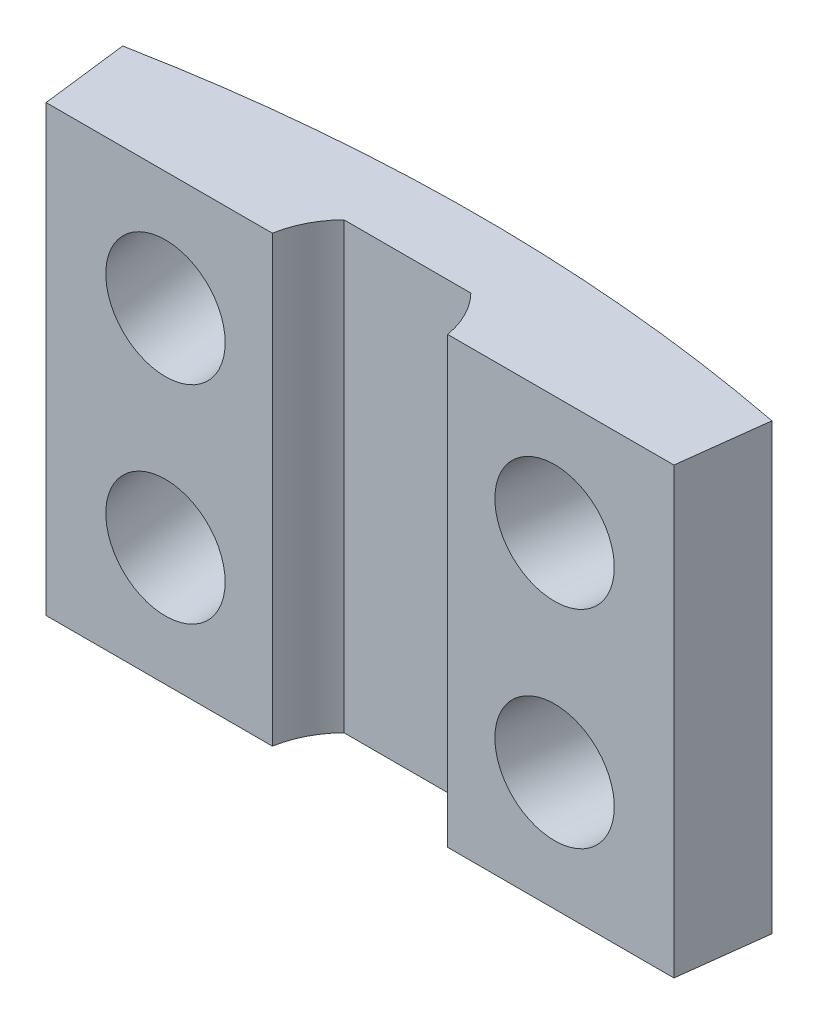
ISO-10303-21;
HEADER;
FILE_DESCRIPTION(('STEP AP214'),'2;1');
FILE_NAME('part.step','',(''),(''),'','','');
FILE_SCHEMA(('AUTOMOTIVE_DESIGN { 1 0 10303 214 1 1 1 1 }'));
ENDSEC;
DATA;
#1=APPLICATION_CONTEXT('core data for automotive mechanical design processes');
#2=APPLICATION_PROTOCOL_DEFINITION('international standard','automotive_design',2000,#1);
#3=PRODUCT_CONTEXT('',#1,'mechanical');
#4=PRODUCT('Part','Part','',(#3));
#5=PRODUCT_RELATED_PRODUCT_CATEGORY('part','',(#4));
#6=PRODUCT_DEFINITION_FORMATION('','',#4);
#7=PRODUCT_DEFINITION_CONTEXT('part definition',#1,'design');
#8=PRODUCT_DEFINITION('design','',#6,#7);
#9=PRODUCT_DEFINITION_SHAPE('','',#8);
#10=(LENGTH_UNIT() NAMED_UNIT(*) SI_UNIT(.MILLI.,.METRE.));
#11=(NAMED_UNIT(*) PLANE_ANGLE_UNIT() SI_UNIT($,.RADIAN.));
#12=(NAMED_UNIT(*) SI_UNIT($,.STERADIAN.) SOLID_ANGLE_UNIT());
#13=UNCERTAINTY_MEASURE_WITH_UNIT(LENGTH_MEASURE(1.E-05),#10,'distance_accuracy_value','');
#14=(GEOMETRIC_REPRESENTATION_CONTEXT(3) GLOBAL_UNCERTAINTY_ASSIGNED_CONTEXT((#13)) GLOBAL_UNIT_ASSIGNED_CONTEXT((#10,
#11,#12)) REPRESENTATION_CONTEXT('',''));
#15=CARTESIAN_POINT('',(0.,0.,0.));
#16=DIRECTION('',(0.,0.,1.));
#17=DIRECTION('',(1.,0.,0.));
#18=AXIS2_PLACEMENT_3D('',#15,#16,#17);
#19=CARTESIAN_POINT('',(0.,15.,0.));
#20=DIRECTION('',(0.,-1.,0.));
#21=DIRECTION('',(0.,0.,-1.));
#22=AXIS2_PLACEMENT_3D('',#19,#20,#21);
#23=CYLINDRICAL_SURFACE('',#22,57.5);
#24=CARTESIAN_POINT('',(8.98833933252168,4.,-56.7931312399963));
#25=CARTESIAN_POINT('',(8.98833445767635,4.11230441527091,-56.7931323111404));
#26=CARTESIAN_POINT('',(8.97895966302704,4.22468939699142,-56.7946181695748));
#27=CARTESIAN_POINT('',(8.94168989126605,4.44636171808973,-56.8004975689089));
#28=CARTESIAN_POINT('',(8.91377284993285,4.55564520512402,-56.8048945738879));
#29=CARTESIAN_POINT('',(8.84020655296178,4.76787114271785,-56.8163895913999));
#30=CARTESIAN_POINT('',(8.79456604268353,4.87081669165127,-56.8234862717865));
#31=CARTESIAN_POINT('',(8.6868458773733,5.06746830297798,-56.8400533409228));
#32=CARTESIAN_POINT('',(8.6247702096139,5.16117659883002,-56.8495231539058));
#33=CARTESIAN_POINT('',(8.4858826551236,5.33677516165288,-56.8704203851645));
#34=CARTESIAN_POINT('',(8.40906367088088,5.41865970319886,-56.8818487460108));
#35=CARTESIAN_POINT('',(8.24286268284989,5.56823796796951,-56.9061706089331));
#36=CARTESIAN_POINT('',(8.15348017660247,5.63593112336117,-56.9190641696037));
#37=CARTESIAN_POINT('',(7.96464578014412,5.75521635514299,-56.9457943936794));
#38=CARTESIAN_POINT('',(7.86519152913229,5.8068046449554,-56.9596312779485));
#39=CARTESIAN_POINT('',(7.65903682424394,5.89239123560131,-56.9877176777634));
#40=CARTESIAN_POINT('',(7.55233640440703,5.92638961905869,-57.0019671913706));
#41=CARTESIAN_POINT('',(7.3347525885909,5.97581803145167,-57.0303728763571));
#42=CARTESIAN_POINT('',(7.22387091716941,5.9912556312315,-57.0445290834506));
#43=CARTESIAN_POINT('',(7.00102826220642,6.00314759630914,-57.0723068494504));
#44=CARTESIAN_POINT('',(6.88906728378478,5.99960205161203,-57.0859284108912));
#45=CARTESIAN_POINT('',(6.66729637600269,5.9736347288227,-57.1122546058396));
#46=CARTESIAN_POINT('',(6.55748553725028,5.95122111542192,-57.1249596333732));
#47=CARTESIAN_POINT('',(6.34308836674338,5.88816653333266,-57.1491633908231));
#48=CARTESIAN_POINT('',(6.23850204850451,5.84752551749329,-57.1606621176189));
#49=CARTESIAN_POINT('',(6.03751028677795,5.74916042405954,-57.1822411214967));
#50=CARTESIAN_POINT('',(5.94110663908763,5.69143260894608,-57.1923210875304));
#51=CARTESIAN_POINT('',(5.75925447719488,5.56053536207274,-57.2109199056997));
#52=CARTESIAN_POINT('',(5.67380599816989,5.48736588073109,-57.2194387528226));
#53=CARTESIAN_POINT('',(5.51626246660309,5.3276161126171,-57.2348419350208));
#54=CARTESIAN_POINT('',(5.44417451180727,5.24102874221427,-57.2417254018486));
#55=CARTESIAN_POINT('',(5.31547319598291,5.05692605964672,-57.2538202810163));
#56=CARTESIAN_POINT('',(5.25885983774198,4.95941074551343,-57.259031693055));
#57=CARTESIAN_POINT('',(5.16273327062933,4.75621620288476,-57.2677791290572));
#58=CARTESIAN_POINT('',(5.12322029971408,4.65053686080886,-57.271315129707));
#59=CARTESIAN_POINT('',(5.06243419534196,4.43401596511271,-57.2767203948077));
#60=CARTESIAN_POINT('',(5.04116099526787,4.32317443034793,-57.2785896653461));
#61=CARTESIAN_POINT('',(5.01747464990619,4.09953776862238,-57.2806694495519));
#62=CARTESIAN_POINT('',(5.01505162671908,3.98674369589612,-57.2808808319889));
#63=CARTESIAN_POINT('',(5.02910954647677,3.76234911716904,-57.2796482622264));
#64=CARTESIAN_POINT('',(5.04559045966649,3.6507486092898,-57.2782043126324));
#65=CARTESIAN_POINT('',(5.0969743183782,3.43193678532828,-57.2736545973242));
#66=CARTESIAN_POINT('',(5.13187276988752,3.32472440538478,-57.2705492370037));
#67=CARTESIAN_POINT('',(5.21908447846909,3.11769952344061,-57.2626672727011));
#68=CARTESIAN_POINT('',(5.27139778336851,3.01788704176354,-57.2578906641292));
#69=CARTESIAN_POINT('',(5.39196284753033,2.82844963391636,-57.246662695309));
#70=CARTESIAN_POINT('',(5.46022124255009,2.73882897235597,-57.2402106376756));
#71=CARTESIAN_POINT('',(5.61070943769256,2.57236205801214,-57.2256554267695));
#72=CARTESIAN_POINT('',(5.69293928383768,2.49551584730982,-57.217552268058));
#73=CARTESIAN_POINT('',(5.86905811165182,2.35674610120479,-57.1997550600527));
#74=CARTESIAN_POINT('',(5.96295206172156,2.29482895818837,-57.1900603322506));
#75=CARTESIAN_POINT('',(6.15968962755423,2.18771864722469,-57.1692049612875));
#76=CARTESIAN_POINT('',(6.26253321949269,2.14252543475902,-57.1580443220288));
#77=CARTESIAN_POINT('',(6.47421185205624,2.07015706497473,-57.1344546662568));
#78=CARTESIAN_POINT('',(6.58304551280602,2.04297777661829,-57.1220259413016));
#79=CARTESIAN_POINT('',(6.8036251228022,2.00739523282434,-57.096173349767));
#80=CARTESIAN_POINT('',(6.91537106681209,1.99899194362853,-57.0827494849768));
#81=CARTESIAN_POINT('',(7.13853686618538,2.00120040178354,-57.0552707879099));
#82=CARTESIAN_POINT('',(7.24995686280173,2.01180209041446,-57.0412162932434));
#83=CARTESIAN_POINT('',(7.46937106027531,2.05169884561501,-57.0128997460013));
#84=CARTESIAN_POINT('',(7.57736525440099,2.08099394891397,-56.9986376930179));
#85=CARTESIAN_POINT('',(7.78687570248917,2.15744432573104,-56.9703936261037));
#86=CARTESIAN_POINT('',(7.8883918561476,2.20459987571669,-56.9564116165113));
#87=CARTESIAN_POINT('',(8.08207970749773,2.31542978613983,-56.9292505102055));
#88=CARTESIAN_POINT('',(8.17425173303823,2.37910356673824,-56.9160713853286));
#89=CARTESIAN_POINT('',(8.34670122222601,2.52119464627854,-56.8910378542256));
#90=CARTESIAN_POINT('',(8.42697364541831,2.59961816121083,-56.879184009884));
#91=CARTESIAN_POINT('',(8.57334148906035,2.76899333354789,-56.857306552019));
#92=CARTESIAN_POINT('',(8.63943339857535,2.85994808441245,-56.8472833918435));
#93=CARTESIAN_POINT('',(8.75559856673434,3.05184635132588,-56.829507831977));
#94=CARTESIAN_POINT('',(8.80566045056312,3.15279689412245,-56.8217570450769));
#95=CARTESIAN_POINT('',(8.88824873360087,3.3616940958968,-56.8088971722002));
#96=CARTESIAN_POINT('',(8.92079600515478,3.4696322549559,-56.8037849421267));
#97=CARTESIAN_POINT('',(8.95883456011537,3.64854175658061,-56.797794744612));
#98=CARTESIAN_POINT('',(8.96988503467434,3.71835228323766,-56.7960493272342));
#99=CARTESIAN_POINT('',(8.98463895242016,3.85876458343219,-56.7937172383111));
#100=CARTESIAN_POINT('',(8.98834239854617,3.92936635665311,-56.7931305663023));
#101=CARTESIAN_POINT('',(8.98833933252168,4.,-56.7931312399963));
#102=B_SPLINE_CURVE_WITH_KNOTS('',3,(#24,#25,#26,#27,#28,#29,#30,#31,#32,#33,#34,#35,#36,#37,
#38,#39,#40,#41,#42,#43,#44,#45,#46,#47,#48,#49,#50,#51,#52,#53,#54,#55,#56,#57,#58,#59,#60,#61,
#62,#63,#64,#65,#66,#67,#68,#69,#70,#71,#72,#73,#74,#75,#76,#77,#78,#79,#80,#81,#82,#83,#84,#85,
#86,#87,#88,#89,#90,#91,#92,#93,#94,#95,#96,#97,#98,#99,#100,#101),.UNSPECIFIED.,.T.,.F.,(4,2,2,
2,2,2,2,2,2,2,2,2,2,2,2,2,2,2,2,2,2,2,2,2,2,2,2,2,2,2,2,2,2,2,2,2,2,2,4),(0.,0.336655420340889,
0.673712160957041,1.01060279726494,1.34741177655965,1.68438330606718,2.02136831607996,
2.35843249847479,2.69549509758614,3.03242016397468,3.36934363289653,3.70612138139576,
4.04290000108114,4.37975234129554,4.71660576312807,5.053637627761,5.39066955310686,
5.72770616819145,6.06474155231013,6.40160031070942,6.73845853888875,7.07523460920001,
7.41201160442209,7.74892900426371,8.08584751394389,8.42291003152592,8.75997165185493,
9.09695594885789,9.43393963997949,9.7707450291909,10.1075510801685,10.4443623448872,
10.7811617881272,11.1181034883221,11.4551285154495,11.7923921663555,12.1292530015639,
12.3409918574817,12.5527306286938),.UNSPECIFIED.);
#103=CARTESIAN_POINT('',(8.98833933252168,4.,-56.7931312399963));
#104=VERTEX_POINT('',#103);
#105=EDGE_CURVE('E171',#104,#104,#102,.T.);
#106=ORIENTED_EDGE('',*,*,#105,.T.);
#107=EDGE_LOOP('',(#106));
#108=FACE_BOUND('',#107,.T.);
#109=CARTESIAN_POINT('',(8.98833933252168,11.,-56.7931312399963));
#110=CARTESIAN_POINT('',(8.98833445767635,11.1123044152709,-56.7931323111404));
#111=CARTESIAN_POINT('',(8.97895966302704,11.2246893969914,-56.7946181695748));
#112=CARTESIAN_POINT('',(8.94168989126605,11.4463617180897,-56.8004975689089));
#113=CARTESIAN_POINT('',(8.91377284993285,11.555645205124,-56.8048945738879));
#114=CARTESIAN_POINT('',(8.84020655296178,11.7678711427179,-56.8163895913999));
#115=CARTESIAN_POINT('',(8.79456604268353,11.8708166916513,-56.8234862717865));
#116=CARTESIAN_POINT('',(8.6868458773733,12.067468302978,-56.8400533409228));
#117=CARTESIAN_POINT('',(8.6247702096139,12.16117659883,-56.8495231539058));
#118=CARTESIAN_POINT('',(8.4858826551236,12.3367751616529,-56.8704203851645));
#119=CARTESIAN_POINT('',(8.40906367088088,12.4186597031989,-56.8818487460108));
#120=CARTESIAN_POINT('',(8.24286268284989,12.5682379679695,-56.9061706089331));
#121=CARTESIAN_POINT('',(8.15348017660248,12.6359311233612,-56.9190641696037));
#122=CARTESIAN_POINT('',(7.96464578014412,12.755216355143,-56.9457943936794));
#123=CARTESIAN_POINT('',(7.8651915291323,12.8068046449554,-56.9596312779485));
#124=CARTESIAN_POINT('',(7.65903682424394,12.8923912356013,-56.9877176777634));
#125=CARTESIAN_POINT('',(7.55233640440703,12.9263896190587,-57.0019671913706));
#126=CARTESIAN_POINT('',(7.3347525885909,12.9758180314517,-57.0303728763571));
#127=CARTESIAN_POINT('',(7.22387091716941,12.9912556312315,-57.0445290834506));
#128=CARTESIAN_POINT('',(7.00102826220642,13.0031475963091,-57.0723068494504));
#129=CARTESIAN_POINT('',(6.88906728378478,12.999602051612,-57.0859284108912));
#130=CARTESIAN_POINT('',(6.66729637600269,12.9736347288227,-57.1122546058396));
#131=CARTESIAN_POINT('',(6.55748553725029,12.9512211154219,-57.1249596333732));
#132=CARTESIAN_POINT('',(6.34308836674338,12.8881665333327,-57.1491633908231));
#133=CARTESIAN_POINT('',(6.23850204850451,12.8475255174933,-57.1606621176189));
#134=CARTESIAN_POINT('',(6.03751028677795,12.7491604240595,-57.1822411214967));
#135=CARTESIAN_POINT('',(5.94110663908763,12.6914326089461,-57.1923210875304));
#136=CARTESIAN_POINT('',(5.75925447719488,12.5605353620727,-57.2109199056997));
#137=CARTESIAN_POINT('',(5.6738059981699,12.4873658807311,-57.2194387528226));
#138=CARTESIAN_POINT('',(5.51626246660309,12.3276161126171,-57.2348419350208));
#139=CARTESIAN_POINT('',(5.44417451180727,12.2410287422143,-57.2417254018486));
#140=CARTESIAN_POINT('',(5.31547319598291,12.0569260596467,-57.2538202810163));
#141=CARTESIAN_POINT('',(5.25885983774198,11.9594107455134,-57.259031693055));
#142=CARTESIAN_POINT('',(5.16273327062933,11.7562162028848,-57.2677791290572));
#143=CARTESIAN_POINT('',(5.12322029971408,11.6505368608089,-57.271315129707));
#144=CARTESIAN_POINT('',(5.06243419534196,11.4340159651127,-57.2767203948077));
#145=CARTESIAN_POINT('',(5.04116099526787,11.3231744303479,-57.2785896653461));
#146=CARTESIAN_POINT('',(5.01747464990619,11.0995377686224,-57.2806694495519));
#147=CARTESIAN_POINT('',(5.01505162671908,10.9867436958961,-57.2808808319889));
#148=CARTESIAN_POINT('',(5.02910954647677,10.762349117169,-57.2796482622264));
#149=CARTESIAN_POINT('',(5.04559045966649,10.6507486092898,-57.2782043126324));
#150=CARTESIAN_POINT('',(5.0969743183782,10.4319367853283,-57.2736545973242));
#151=CARTESIAN_POINT('',(5.13187276988752,10.3247244053848,-57.2705492370037));
#152=CARTESIAN_POINT('',(5.21908447846909,10.1176995234406,-57.2626672727011));
#153=CARTESIAN_POINT('',(5.27139778336851,10.0178870417635,-57.2578906641292));
#154=CARTESIAN_POINT('',(5.39196284753033,9.82844963391636,-57.246662695309));
#155=CARTESIAN_POINT('',(5.46022124255009,9.73882897235597,-57.2402106376756));
#156=CARTESIAN_POINT('',(5.61070943769256,9.57236205801214,-57.2256554267695));
#157=CARTESIAN_POINT('',(5.69293928383768,9.49551584730982,-57.217552268058));
#158=CARTESIAN_POINT('',(5.86905811165182,9.35674610120479,-57.1997550600527));
#159=CARTESIAN_POINT('',(5.96295206172156,9.29482895818837,-57.1900603322506));
#160=CARTESIAN_POINT('',(6.15968962755423,9.18771864722469,-57.1692049612875));
#161=CARTESIAN_POINT('',(6.26253321949269,9.14252543475902,-57.1580443220288));
#162=CARTESIAN_POINT('',(6.47421185205624,9.07015706497473,-57.1344546662568));
#163=CARTESIAN_POINT('',(6.58304551280602,9.04297777661829,-57.1220259413016));
#164=CARTESIAN_POINT('',(6.8036251228022,9.00739523282434,-57.096173349767));
#165=CARTESIAN_POINT('',(6.91537106681209,8.99899194362853,-57.0827494849768));
#166=CARTESIAN_POINT('',(7.13853686618538,9.00120040178353,-57.0552707879099));
#167=CARTESIAN_POINT('',(7.24995686280173,9.01180209041446,-57.0412162932434));
#168=CARTESIAN_POINT('',(7.4693710602753,9.05169884561501,-57.0128997460013));
#169=CARTESIAN_POINT('',(7.57736525440099,9.08099394891397,-56.9986376930179));
#170=CARTESIAN_POINT('',(7.78687570248917,9.15744432573104,-56.9703936261037));
#171=CARTESIAN_POINT('',(7.8883918561476,9.20459987571669,-56.9564116165113));
#172=CARTESIAN_POINT('',(8.08207970749773,9.31542978613983,-56.9292505102055));
#173=CARTESIAN_POINT('',(8.17425173303823,9.37910356673824,-56.9160713853286));
#174=CARTESIAN_POINT('',(8.34670122222601,9.52119464627854,-56.8910378542256));
#175=CARTESIAN_POINT('',(8.42697364541831,9.59961816121083,-56.879184009884));
#176=CARTESIAN_POINT('',(8.57334148906035,9.76899333354789,-56.857306552019));
#177=CARTESIAN_POINT('',(8.63943339857535,9.85994808441245,-56.8472833918435));
#178=CARTESIAN_POINT('',(8.75559856673434,10.0518463513259,-56.829507831977));
#179=CARTESIAN_POINT('',(8.80566045056312,10.1527968941224,-56.8217570450769));
#180=CARTESIAN_POINT('',(8.88824873360087,10.3616940958968,-56.8088971722002));
#181=CARTESIAN_POINT('',(8.92079600515478,10.4696322549559,-56.8037849421267));
#182=CARTESIAN_POINT('',(8.95883456011537,10.6485417565806,-56.797794744612));
#183=CARTESIAN_POINT('',(8.96988503467434,10.7183522832377,-56.7960493272342));
#184=CARTESIAN_POINT('',(8.98463895242016,10.8587645834322,-56.7937172383111));
#185=CARTESIAN_POINT('',(8.98834239854617,10.9293663566531,-56.7931305663023));
#186=CARTESIAN_POINT('',(8.98833933252168,11.,-56.7931312399963));
#187=B_SPLINE_CURVE_WITH_KNOTS('',3,(#109,#110,#111,#112,#113,#114,#115,#116,#117,#118,#119,
#120,#121,#122,#123,#124,#125,#126,#127,#128,#129,#130,#131,#132,#133,#134,#135,#136,#137,#138,
#139,#140,#141,#142,#143,#144,#145,#146,#147,#148,#149,#150,#151,#152,#153,#154,#155,#156,#157,
#158,#159,#160,#161,#162,#163,#164,#165,#166,#167,#168,#169,#170,#171,#172,#173,#174,#175,#176,
#177,#178,#179,#180,#181,#182,#183,#184,#185,#186),.UNSPECIFIED.,.T.,.F.,(4,2,2,2,2,2,2,2,2,2,2,
2,2,2,2,2,2,2,2,2,2,2,2,2,2,2,2,2,2,2,2,2,2,2,2,2,2,2,4),(0.,0.336655420340888,
0.673712160957041,1.01060279726494,1.34741177655966,1.68438330606718,2.02136831607996,
2.35843249847479,2.69549509758614,3.03242016397468,3.36934363289653,3.70612138139576,
4.04290000108114,4.37975234129554,4.71660576312806,5.05363762776099,5.39066955310686,
5.72770616819145,6.06474155231012,6.40160031070942,6.73845853888874,7.07523460920001,
7.41201160442209,7.7489290042637,8.08584751394389,8.42291003152592,8.75997165185493,
9.09695594885789,9.43393963997949,9.77074502919089,10.1075510801685,10.4443623448872,
10.7811617881272,11.1181034883221,11.4551285154495,11.7923921663555,12.1292530015639,
12.3409918574817,12.5527306286938),.UNSPECIFIED.);
#188=CARTESIAN_POINT('',(8.98833933252168,11.,-56.7931312399963));
#189=VERTEX_POINT('',#188);
#190=EDGE_CURVE('E168',#189,#189,#187,.T.);
#191=ORIENTED_EDGE('',*,*,#190,.T.);
#192=EDGE_LOOP('',(#191));
#193=FACE_BOUND('',#192,.T.);
#194=CARTESIAN_POINT('',(0.,0.,0.));
#195=DIRECTION('',(0.,1.,0.));
#196=DIRECTION('',(0.,0.,1.));
#197=AXIS2_PLACEMENT_3D('',#194,#195,#196);
#198=CIRCLE('',#197,57.5);
#199=CARTESIAN_POINT('',(10.9606955542857,0.,-56.4456654931648));
#200=VERTEX_POINT('',#199);
#201=CARTESIAN_POINT('',(-10.9606955542861,0.,-56.4456654931648));
#202=VERTEX_POINT('',#201);
#203=EDGE_CURVE('E125',#200,#202,#198,.T.);
#204=ORIENTED_EDGE('',*,*,#203,.T.);
#205=DIRECTION('',(0.,-1.,0.));
#206=VECTOR('',#205,1.);
#207=CARTESIAN_POINT('',(-10.9606955542861,15.,-56.4456654931648));
#208=LINE('',#207,#206);
#209=CARTESIAN_POINT('',(-10.9606955542861,15.,-56.4456654931648));
#210=VERTEX_POINT('',#209);
#211=EDGE_CURVE('E122',#210,#202,#208,.T.);
#212=ORIENTED_EDGE('',*,*,#211,.F.);
#213=CARTESIAN_POINT('',(0.,15.,0.));
#214=DIRECTION('',(0.,1.,0.));
#215=DIRECTION('',(0.,0.,1.));
#216=AXIS2_PLACEMENT_3D('',#213,#214,#215);
#217=CIRCLE('',#216,57.5);
#218=CARTESIAN_POINT('',(10.9606955542857,15.,-56.4456654931648));
#219=VERTEX_POINT('',#218);
#220=EDGE_CURVE('E111',#219,#210,#217,.T.);
#221=ORIENTED_EDGE('',*,*,#220,.F.);
#222=DIRECTION('',(0.,-1.,0.));
#223=VECTOR('',#222,1.);
#224=CARTESIAN_POINT('',(10.9606955542857,15.,-56.4456654931648));
#225=LINE('',#224,#223);
#226=EDGE_CURVE('E126',#219,#200,#225,.T.);
#227=ORIENTED_EDGE('',*,*,#226,.T.);
#228=EDGE_LOOP('',(#204,#212,#221,#227));
#229=FACE_BOUND('',#228,.T.);
#230=CARTESIAN_POINT('',(-5.0181547259568,11.,-57.2806086136168));
#231=CARTESIAN_POINT('',(-5.0181597151316,10.8876955847291,-57.2806084736116));
#232=CARTESIAN_POINT('',(-5.02761550000359,10.7753106030086,-57.2797822276079));
#233=CARTESIAN_POINT('',(-5.06520055569445,10.5536382819103,-57.2764706098219));
#234=CARTESIAN_POINT('',(-5.0933520733698,10.444354794876,-57.2739832614025));
#235=CARTESIAN_POINT('',(-5.16751403334524,10.2321288572821,-57.2673395297524));
#236=CARTESIAN_POINT('',(-5.21351566778487,10.1291833083487,-57.2631839696396));
#237=CARTESIAN_POINT('',(-5.32204402058911,9.93253169702202,-57.2531990594333));
#238=CARTESIAN_POINT('',(-5.38456673082962,9.83882340116998,-57.2473701152844));
#239=CARTESIAN_POINT('',(-5.52438422918337,9.66322483834712,-57.2340466690082));
#240=CARTESIAN_POINT('',(-5.60168613201046,9.58134029680115,-57.2265513644097));
#241=CARTESIAN_POINT('',(-5.76883423158247,9.43176203203049,-57.2099431059833));
#242=CARTESIAN_POINT('',(-5.85868093003662,9.36406887663883,-57.2008300874536));
#243=CARTESIAN_POINT('',(-6.04837276437227,9.24478364485701,-57.181083134491));
#244=CARTESIAN_POINT('',(-6.14822024436061,9.1931953550446,-57.1704488432321));
#245=CARTESIAN_POINT('',(-6.35504598854926,9.10760876439869,-57.1478276199456));
#246=CARTESIAN_POINT('',(-6.4620242192521,9.07361038094131,-57.135840694272));
#247=CARTESIAN_POINT('',(-6.68001682300304,9.02418196854834,-57.1107643198422));
#248=CARTESIAN_POINT('',(-6.79102953136024,9.0087443687685,-57.0976753229478));
#249=CARTESIAN_POINT('',(-7.01397285690901,8.99685240369086,-57.0707174530738));
#250=CARTESIAN_POINT('',(-7.12590346974599,9.00039794838797,-57.0568485837921));
#251=CARTESIAN_POINT('',(-7.34745571676513,9.0263652711773,-57.02874153984));
#252=CARTESIAN_POINT('',(-7.45707832864994,9.04877888457808,-57.0145035274897));
#253=CARTESIAN_POINT('',(-7.67096240580139,9.11183346666734,-56.986120960003));
#254=CARTESIAN_POINT('',(-7.77522385719893,9.15247448250671,-56.9719764051085));
#255=CARTESIAN_POINT('',(-7.97546573814216,9.25083957594046,-56.9442901123516));
#256=CARTESIAN_POINT('',(-8.07144434998394,9.30856739105391,-56.930748507123));
#257=CARTESIAN_POINT('',(-8.25239418682996,9.43946463792726,-56.9048008411825));
#258=CARTESIAN_POINT('',(-8.33736537648898,9.5126341192689,-56.8923947841169));
#259=CARTESIAN_POINT('',(-8.49395555890635,9.6723838873829,-56.8692271961788));
#260=CARTESIAN_POINT('',(-8.56556745470398,9.75897125778572,-56.8584665399496));
#261=CARTESIAN_POINT('',(-8.69337180750975,9.94307394035328,-56.8390664832254));
#262=CARTESIAN_POINT('',(-8.74956426174021,10.0405892544866,-56.8304270831125));
#263=CARTESIAN_POINT('',(-8.84495165529049,10.2437837971152,-56.815659561548));
#264=CARTESIAN_POINT('',(-8.88414635808206,10.3494631391911,-56.809531475042));
#265=CARTESIAN_POINT('',(-8.94443450735069,10.5659840348873,-56.8000706910728));
#266=CARTESIAN_POINT('',(-8.96552801993882,10.6768255696521,-56.7967379834));
#267=CARTESIAN_POINT('',(-8.98901392495185,10.9004622313776,-56.7930257435567));
#268=CARTESIAN_POINT('',(-8.99141611203483,11.0132563041039,-56.7926446646695));
#269=CARTESIAN_POINT('',(-8.97747758696021,11.237650882831,-56.7948496260926));
#270=CARTESIAN_POINT('',(-8.96113690430417,11.3492513907102,-56.7974356617326));
#271=CARTESIAN_POINT('',(-8.91017869004483,11.5680632146717,-56.805451972916));
#272=CARTESIAN_POINT('',(-8.87556561703644,11.6752755946152,-56.8108815546112));
#273=CARTESIAN_POINT('',(-8.78903764917339,11.8823004765594,-56.8243321401922));
#274=CARTESIAN_POINT('',(-8.73712270680184,11.9821129582365,-56.8323531511951));
#275=CARTESIAN_POINT('',(-8.61742264880672,12.1715503660836,-56.8506260298993));
#276=CARTESIAN_POINT('',(-8.5496309258234,12.261171027644,-56.8608788262657));
#277=CARTESIAN_POINT('',(-8.40009164900843,12.4276379419879,-56.8831623567627));
#278=CARTESIAN_POINT('',(-8.31834404920565,12.5044841526902,-56.8951930967499));
#279=CARTESIAN_POINT('',(-8.14315116896383,12.6432538987952,-56.9205315425583));
#280=CARTESIAN_POINT('',(-8.04970090356077,12.7051710418116,-56.9338397919907));
#281=CARTESIAN_POINT('',(-7.85376191335855,12.8122813527753,-56.9611990395372));
#282=CARTESIAN_POINT('',(-7.75127321262025,12.857474565241,-56.9752500356741));
#283=CARTESIAN_POINT('',(-7.54017548585896,12.9298429350253,-57.0035707895418));
#284=CARTESIAN_POINT('',(-7.43156786925745,12.9570222233817,-57.0178404963484));
#285=CARTESIAN_POINT('',(-7.21128610842431,12.9926047671757,-57.0461188746501));
#286=CARTESIAN_POINT('',(-7.09961196970652,13.0010080563715,-57.0601275466146));
#287=CARTESIAN_POINT('',(-6.87642744984061,12.9987995982165,-57.0874537775043));
#288=CARTESIAN_POINT('',(-6.76491701331066,12.9881979095855,-57.1007716981836));
#289=CARTESIAN_POINT('',(-6.54516996243213,12.948301154385,-57.1263773719859));
#290=CARTESIAN_POINT('',(-6.43693335451648,12.919006051086,-57.1386651230849));
#291=CARTESIAN_POINT('',(-6.22681340391902,12.842555674269,-57.1619451904148));
#292=CARTESIAN_POINT('',(-6.12493015961137,12.7954001242833,-57.1729374865896));
#293=CARTESIAN_POINT('',(-5.93042479889069,12.6845702138602,-57.1934405133734));
#294=CARTESIAN_POINT('',(-5.83780235755396,12.6208964332618,-57.2029512959693));
#295=CARTESIAN_POINT('',(-5.6644191958986,12.4788053537215,-57.220380675046));
#296=CARTESIAN_POINT('',(-5.58366350224402,12.4003818387892,-57.2282985973244));
#297=CARTESIAN_POINT('',(-5.43635077301631,12.2310066664521,-57.242480579645));
#298=CARTESIAN_POINT('',(-5.36979725376295,12.1400519155875,-57.2487442301966));
#299=CARTESIAN_POINT('',(-5.2527823904179,11.9481536486741,-57.2595995781097));
#300=CARTESIAN_POINT('',(-5.20233247343024,11.8472031058776,-57.2641900885383));
#301=CARTESIAN_POINT('',(-5.11908633053475,11.6383059041032,-57.2716921228325));
#302=CARTESIAN_POINT('',(-5.08626909165391,11.5303677450441,-57.2746056454713));
#303=CARTESIAN_POINT('',(-5.04791128440415,11.3514582434194,-57.2779957417451));
#304=CARTESIAN_POINT('',(-5.03676680148561,11.2816477167623,-57.2789755224755));
#305=CARTESIAN_POINT('',(-5.02188695477805,11.1412354165678,-57.2802820023088));
#306=CARTESIAN_POINT('',(-5.01815158802502,11.0706336433469,-57.2806087016729));
#307=CARTESIAN_POINT('',(-5.0181547259568,11.,-57.2806086136168));
#308=B_SPLINE_CURVE_WITH_KNOTS('',3,(#230,#231,#232,#233,#234,#235,#236,#237,#238,#239,#240,
#241,#242,#243,#244,#245,#246,#247,#248,#249,#250,#251,#252,#253,#254,#255,#256,#257,#258,#259,
#260,#261,#262,#263,#264,#265,#266,#267,#268,#269,#270,#271,#272,#273,#274,#275,#276,#277,#278,
#279,#280,#281,#282,#283,#284,#285,#286,#287,#288,#289,#290,#291,#292,#293,#294,#295,#296,#297,
#298,#299,#300,#301,#302,#303,#304,#305,#306,#307),.UNSPECIFIED.,.T.,.F.,(4,2,2,2,2,2,2,2,2,2,2,
2,2,2,2,2,2,2,2,2,2,2,2,2,2,2,2,2,2,2,2,2,2,2,2,2,2,2,4),(0.,0.336655420340889,
0.673712160957041,1.01060279726494,1.34741177655966,1.68438330606718,2.02136831607996,
2.35843249847479,2.69549509758614,3.03242016397468,3.36934363289653,3.70612138139576,
4.04290000108114,4.37975234129554,4.71660576312806,5.053637627761,5.39066955310686,
5.72770616819145,6.06474155231012,6.40160031070942,6.73845853888874,7.07523460920001,
7.41201160442209,7.7489290042637,8.08584751394389,8.42291003152592,8.75997165185493,
9.09695594885789,9.43393963997949,9.77074502919089,10.1075510801685,10.4443623448872,
10.7811617881272,11.1181034883221,11.4551285154495,11.7923921663555,12.1292530015639,
12.3409918574817,12.5527306286938),.UNSPECIFIED.);
#309=CARTESIAN_POINT('',(-5.0181547259568,11.,-57.2806086136168));
#310=VERTEX_POINT('',#309);
#311=EDGE_CURVE('E139',#310,#310,#308,.T.);
#312=ORIENTED_EDGE('',*,*,#311,.F.);
#313=EDGE_LOOP('',(#312));
#314=FACE_BOUND('',#313,.T.);
#315=CARTESIAN_POINT('',(-5.0181547259568,4.,-57.2806086136168));
#316=CARTESIAN_POINT('',(-5.0181597151316,3.88769558472909,-57.2806084736116));
#317=CARTESIAN_POINT('',(-5.02761550000359,3.77531060300858,-57.2797822276079));
#318=CARTESIAN_POINT('',(-5.06520055569445,3.55363828191027,-57.2764706098219));
#319=CARTESIAN_POINT('',(-5.0933520733698,3.44435479487598,-57.2739832614025));
#320=CARTESIAN_POINT('',(-5.16751403334524,3.23212885728215,-57.2673395297524));
#321=CARTESIAN_POINT('',(-5.21351566778487,3.12918330834873,-57.2631839696396));
#322=CARTESIAN_POINT('',(-5.32204402058911,2.93253169702202,-57.2531990594333));
#323=CARTESIAN_POINT('',(-5.38456673082962,2.83882340116999,-57.2473701152844));
#324=CARTESIAN_POINT('',(-5.52438422918337,2.66322483834712,-57.2340466690082));
#325=CARTESIAN_POINT('',(-5.60168613201046,2.58134029680115,-57.2265513644097));
#326=CARTESIAN_POINT('',(-5.76883423158247,2.43176203203049,-57.2099431059833));
#327=CARTESIAN_POINT('',(-5.85868093003662,2.36406887663883,-57.2008300874536));
#328=CARTESIAN_POINT('',(-6.04837276437227,2.24478364485701,-57.181083134491));
#329=CARTESIAN_POINT('',(-6.14822024436061,2.1931953550446,-57.1704488432321));
#330=CARTESIAN_POINT('',(-6.35504598854926,2.10760876439869,-57.1478276199456));
#331=CARTESIAN_POINT('',(-6.4620242192521,2.07361038094131,-57.135840694272));
#332=CARTESIAN_POINT('',(-6.68001682300304,2.02418196854834,-57.1107643198422));
#333=CARTESIAN_POINT('',(-6.79102953136024,2.0087443687685,-57.0976753229478));
#334=CARTESIAN_POINT('',(-7.01397285690901,1.99685240369086,-57.0707174530738));
#335=CARTESIAN_POINT('',(-7.12590346974599,2.00039794838797,-57.0568485837921));
#336=CARTESIAN_POINT('',(-7.34745571676513,2.0263652711773,-57.02874153984));
#337=CARTESIAN_POINT('',(-7.45707832864994,2.04877888457808,-57.0145035274897));
#338=CARTESIAN_POINT('',(-7.67096240580139,2.11183346666734,-56.986120960003));
#339=CARTESIAN_POINT('',(-7.77522385719893,2.15247448250671,-56.9719764051085));
#340=CARTESIAN_POINT('',(-7.97546573814216,2.25083957594046,-56.9442901123516));
#341=CARTESIAN_POINT('',(-8.07144434998394,2.30856739105392,-56.930748507123));
#342=CARTESIAN_POINT('',(-8.25239418682996,2.43946463792726,-56.9048008411825));
#343=CARTESIAN_POINT('',(-8.33736537648898,2.51263411926891,-56.8923947841169));
#344=CARTESIAN_POINT('',(-8.49395555890635,2.6723838873829,-56.8692271961788));
#345=CARTESIAN_POINT('',(-8.56556745470398,2.75897125778573,-56.8584665399496));
#346=CARTESIAN_POINT('',(-8.69337180750975,2.94307394035328,-56.8390664832254));
#347=CARTESIAN_POINT('',(-8.74956426174021,3.04058925448657,-56.8304270831125));
#348=CARTESIAN_POINT('',(-8.84495165529049,3.24378379711524,-56.815659561548));
#349=CARTESIAN_POINT('',(-8.88414635808206,3.34946313919114,-56.809531475042));
#350=CARTESIAN_POINT('',(-8.94443450735069,3.56598403488729,-56.8000706910728));
#351=CARTESIAN_POINT('',(-8.96552801993882,3.67682556965207,-56.7967379834));
#352=CARTESIAN_POINT('',(-8.98901392495185,3.90046223137762,-56.7930257435567));
#353=CARTESIAN_POINT('',(-8.99141611203483,4.01325630410387,-56.7926446646695));
#354=CARTESIAN_POINT('',(-8.97747758696021,4.23765088283096,-56.7948496260926));
#355=CARTESIAN_POINT('',(-8.96113690430417,4.3492513907102,-56.7974356617326));
#356=CARTESIAN_POINT('',(-8.91017869004483,4.56806321467172,-56.805451972916));
#357=CARTESIAN_POINT('',(-8.87556561703643,4.67527559461522,-56.8108815546112));
#358=CARTESIAN_POINT('',(-8.78903764917338,4.88230047655938,-56.8243321401922));
#359=CARTESIAN_POINT('',(-8.73712270680183,4.98211295823646,-56.8323531511951));
#360=CARTESIAN_POINT('',(-8.61742264880672,5.17155036608364,-56.8506260298993));
#361=CARTESIAN_POINT('',(-8.5496309258234,5.26117102764403,-56.8608788262657));
#362=CARTESIAN_POINT('',(-8.40009164900843,5.42763794198786,-56.8831623567627));
#363=CARTESIAN_POINT('',(-8.31834404920565,5.50448415269018,-56.8951930967499));
#364=CARTESIAN_POINT('',(-8.14315116896384,5.64325389879521,-56.9205315425583));
#365=CARTESIAN_POINT('',(-8.04970090356077,5.70517104181163,-56.9338397919907));
#366=CARTESIAN_POINT('',(-7.85376191335855,5.81228135277531,-56.9611990395372));
#367=CARTESIAN_POINT('',(-7.75127321262025,5.85747456524098,-56.9752500356741));
#368=CARTESIAN_POINT('',(-7.54017548585896,5.92984293502527,-57.0035707895418));
#369=CARTESIAN_POINT('',(-7.43156786925744,5.95702222338171,-57.0178404963484));
#370=CARTESIAN_POINT('',(-7.21128610842431,5.99260476717566,-57.0461188746501));
#371=CARTESIAN_POINT('',(-7.09961196970652,6.00100805637147,-57.0601275466146));
#372=CARTESIAN_POINT('',(-6.87642744984061,5.99879959821646,-57.0874537775043));
#373=CARTESIAN_POINT('',(-6.76491701331066,5.98819790958554,-57.1007716981836));
#374=CARTESIAN_POINT('',(-6.54516996243212,5.94830115438499,-57.1263773719859));
#375=CARTESIAN_POINT('',(-6.43693335451648,5.91900605108603,-57.1386651230849));
#376=CARTESIAN_POINT('',(-6.22681340391902,5.84255567426896,-57.1619451904148));
#377=CARTESIAN_POINT('',(-6.12493015961137,5.79540012428331,-57.1729374865896));
#378=CARTESIAN_POINT('',(-5.93042479889069,5.68457021386017,-57.1934405133734));
#379=CARTESIAN_POINT('',(-5.83780235755396,5.62089643326176,-57.2029512959693));
#380=CARTESIAN_POINT('',(-5.6644191958986,5.47880535372145,-57.220380675046));
#381=CARTESIAN_POINT('',(-5.58366350224402,5.40038183878917,-57.2282985973244));
#382=CARTESIAN_POINT('',(-5.43635077301631,5.23100666645211,-57.242480579645));
#383=CARTESIAN_POINT('',(-5.36979725376295,5.14005191558755,-57.2487442301966));
#384=CARTESIAN_POINT('',(-5.2527823904179,4.94815364867412,-57.2595995781097));
#385=CARTESIAN_POINT('',(-5.20233247343024,4.84720310587755,-57.2641900885383));
#386=CARTESIAN_POINT('',(-5.11908633053475,4.6383059041032,-57.2716921228325));
#387=CARTESIAN_POINT('',(-5.08626909165391,4.5303677450441,-57.2746056454713));
#388=CARTESIAN_POINT('',(-5.04791128440415,4.35145824341939,-57.2779957417451));
#389=CARTESIAN_POINT('',(-5.03676680148561,4.28164771676234,-57.2789755224755));
#390=CARTESIAN_POINT('',(-5.02188695477805,4.14123541656781,-57.2802820023088));
#391=CARTESIAN_POINT('',(-5.01815158802502,4.07063364334689,-57.2806087016729));
#392=CARTESIAN_POINT('',(-5.0181547259568,4.,-57.2806086136168));
#393=B_SPLINE_CURVE_WITH_KNOTS('',3,(#315,#316,#317,#318,#319,#320,#321,#322,#323,#324,#325,
#326,#327,#328,#329,#330,#331,#332,#333,#334,#335,#336,#337,#338,#339,#340,#341,#342,#343,#344,
#345,#346,#347,#348,#349,#350,#351,#352,#353,#354,#355,#356,#357,#358,#359,#360,#361,#362,#363,
#364,#365,#366,#367,#368,#369,#370,#371,#372,#373,#374,#375,#376,#377,#378,#379,#380,#381,#382,
#383,#384,#385,#386,#387,#388,#389,#390,#391,#392),.UNSPECIFIED.,.T.,.F.,(4,2,2,2,2,2,2,2,2,2,2,
2,2,2,2,2,2,2,2,2,2,2,2,2,2,2,2,2,2,2,2,2,2,2,2,2,2,2,4),(0.,0.336655420340889,
0.673712160957041,1.01060279726494,1.34741177655966,1.68438330606718,2.02136831607996,
2.35843249847479,2.69549509758614,3.03242016397468,3.36934363289653,3.70612138139576,
4.04290000108114,4.37975234129554,4.71660576312807,5.05363762776099,5.39066955310686,
5.72770616819145,6.06474155231013,6.40160031070942,6.73845853888875,7.07523460920001,
7.41201160442209,7.7489290042637,8.08584751394389,8.42291003152592,8.75997165185493,
9.09695594885789,9.43393963997949,9.77074502919089,10.1075510801685,10.4443623448872,
10.7811617881272,11.1181034883221,11.4551285154495,11.7923921663555,12.1292530015639,
12.3409918574817,12.5527306286938),.UNSPECIFIED.);
#394=CARTESIAN_POINT('',(-5.0181547259568,4.,-57.2806086136168));
#395=VERTEX_POINT('',#394);
#396=EDGE_CURVE('E165',#395,#395,#393,.T.);
#397=ORIENTED_EDGE('',*,*,#396,.F.);
#398=EDGE_LOOP('',(#397));
#399=FACE_BOUND('',#398,.T.);
#400=ADVANCED_FACE('F36',(#108,#193,#229,#314,#399),#23,.T.);
#401=CARTESIAN_POINT('',(0.,15.,-53.));
#402=DIRECTION('',(0.,-1.,0.));
#403=DIRECTION('',(0.,0.,-1.));
#404=AXIS2_PLACEMENT_3D('',#401,#402,#403);
#405=CYLINDRICAL_SURFACE('',#404,3.);
#406=CARTESIAN_POINT('',(0.,0.,-53.));
#407=DIRECTION('',(0.,-1.,0.));
#408=DIRECTION('',(0.,0.,1.));
#409=AXIS2_PLACEMENT_3D('',#406,#407,#408);
#410=CIRCLE('',#409,3.);
#411=CARTESIAN_POINT('',(-2.95803989154981,0.,-53.5));
#412=VERTEX_POINT('',#411);
#413=CARTESIAN_POINT('',(-2.14242852856285,0.,-55.1));
#414=VERTEX_POINT('',#413);
#415=EDGE_CURVE('E135',#412,#414,#410,.T.);
#416=ORIENTED_EDGE('',*,*,#415,.T.);
#417=DIRECTION('',(0.,-1.,0.));
#418=VECTOR('',#417,1.);
#419=CARTESIAN_POINT('',(-2.14242852856285,15.,-55.1));
#420=LINE('',#419,#418);
#421=CARTESIAN_POINT('',(-2.14242852856285,15.,-55.1));
#422=VERTEX_POINT('',#421);
#423=EDGE_CURVE('E11',#422,#414,#420,.T.);
#424=ORIENTED_EDGE('',*,*,#423,.F.);
#425=CARTESIAN_POINT('',(0.,15.,-53.));
#426=DIRECTION('',(0.,-1.,0.));
#427=DIRECTION('',(0.,0.,1.));
#428=AXIS2_PLACEMENT_3D('',#425,#426,#427);
#429=CIRCLE('',#428,3.);
#430=CARTESIAN_POINT('',(-2.95803989154981,15.,-53.5));
#431=VERTEX_POINT('',#430);
#432=EDGE_CURVE('E150',#431,#422,#429,.T.);
#433=ORIENTED_EDGE('',*,*,#432,.F.);
#434=DIRECTION('',(0.,-1.,0.));
#435=VECTOR('',#434,1.);
#436=CARTESIAN_POINT('',(-2.95803989154981,15.,-53.5));
#437=LINE('',#436,#435);
#438=EDGE_CURVE('E131',#431,#412,#437,.T.);
#439=ORIENTED_EDGE('',*,*,#438,.T.);
#440=EDGE_LOOP('',(#416,#424,#433,#439));
#441=FACE_BOUND('',#440,.T.);
#442=ADVANCED_FACE('F38',(#441),#405,.F.);
#443=CARTESIAN_POINT('',(-2.14242852856285,15.,-55.1));
#444=DIRECTION('',(0.,0.,-1.));
#445=DIRECTION('',(-1.,0.,0.));
#446=AXIS2_PLACEMENT_3D('',#443,#444,#445);
#447=PLANE('',#446);
#448=DIRECTION('',(1.,0.,0.));
#449=VECTOR('',#448,1.);
#450=CARTESIAN_POINT('',(-2.14242852856285,0.,-55.1));
#451=LINE('',#450,#449);
#452=CARTESIAN_POINT('',(2.14242852856285,0.,-55.1));
#453=VERTEX_POINT('',#452);
#454=EDGE_CURVE('E138',#414,#453,#451,.T.);
#455=ORIENTED_EDGE('',*,*,#454,.T.);
#456=DIRECTION('',(0.,-1.,0.));
#457=VECTOR('',#456,1.);
#458=CARTESIAN_POINT('',(2.14242852856285,15.,-55.1));
#459=LINE('',#458,#457);
#460=CARTESIAN_POINT('',(2.14242852856285,15.,-55.1));
#461=VERTEX_POINT('',#460);
#462=EDGE_CURVE('E46',#461,#453,#459,.T.);
#463=ORIENTED_EDGE('',*,*,#462,.F.);
#464=DIRECTION('',(1.,0.,0.));
#465=VECTOR('',#464,1.);
#466=CARTESIAN_POINT('',(-2.14242852856285,15.,-55.1));
#467=LINE('',#466,#465);
#468=EDGE_CURVE('E98',#422,#461,#467,.T.);
#469=ORIENTED_EDGE('',*,*,#468,.F.);
#470=ORIENTED_EDGE('',*,*,#423,.T.);
#471=EDGE_LOOP('',(#455,#463,#469,#470));
#472=FACE_BOUND('',#471,.T.);
#473=ADVANCED_FACE('F258',(#472),#447,.F.);
#474=CARTESIAN_POINT('',(0.,15.,-53.));
#475=DIRECTION('',(0.,-1.,0.));
#476=DIRECTION('',(0.,0.,-1.));
#477=AXIS2_PLACEMENT_3D('',#474,#475,#476);
#478=CYLINDRICAL_SURFACE('',#477,3.);
#479=CARTESIAN_POINT('',(0.,0.,-53.));
#480=DIRECTION('',(0.,-1.,0.));
#481=DIRECTION('',(0.,0.,1.));
#482=AXIS2_PLACEMENT_3D('',#479,#480,#481);
#483=CIRCLE('',#482,3.);
#484=CARTESIAN_POINT('',(2.95803989154981,0.,-53.5));
#485=VERTEX_POINT('',#484);
#486=EDGE_CURVE('E141',#453,#485,#483,.T.);
#487=ORIENTED_EDGE('',*,*,#486,.T.);
#488=DIRECTION('',(0.,-1.,0.));
#489=VECTOR('',#488,1.);
#490=CARTESIAN_POINT('',(2.95803989154981,15.,-53.5));
#491=LINE('',#490,#489);
#492=CARTESIAN_POINT('',(2.95803989154981,15.,-53.5));
#493=VERTEX_POINT('',#492);
#494=EDGE_CURVE('E157',#493,#485,#491,.T.);
#495=ORIENTED_EDGE('',*,*,#494,.F.);
#496=CARTESIAN_POINT('',(0.,15.,-53.));
#497=DIRECTION('',(0.,-1.,0.));
#498=DIRECTION('',(0.,0.,1.));
#499=AXIS2_PLACEMENT_3D('',#496,#497,#498);
#500=CIRCLE('',#499,3.);
#501=EDGE_CURVE('E223',#461,#493,#500,.T.);
#502=ORIENTED_EDGE('',*,*,#501,.F.);
#503=ORIENTED_EDGE('',*,*,#462,.T.);
#504=EDGE_LOOP('',(#487,#495,#502,#503));
#505=FACE_BOUND('',#504,.T.);
#506=ADVANCED_FACE('F265',(#505),#478,.F.);
#507=CARTESIAN_POINT('',(2.95803989154981,15.,-53.5));
#508=DIRECTION('',(0.,0.,-1.));
#509=DIRECTION('',(-1.,0.,0.));
#510=AXIS2_PLACEMENT_3D('',#507,#508,#509);
#511=PLANE('',#510);
#512=CARTESIAN_POINT('',(6.56897400830541,4.,-53.5));
#513=DIRECTION('',(0.,0.,-1.));
#514=DIRECTION('',(-1.,0.,0.));
#515=AXIS2_PLACEMENT_3D('',#512,#513,#514);
#516=ELLIPSE('',#515,2.0150196509177,2.);
#517=CARTESIAN_POINT('',(4.55395435738771,4.,-53.5));
#518=VERTEX_POINT('',#517);
#519=EDGE_CURVE('E40',#518,#518,#516,.T.);
#520=ORIENTED_EDGE('',*,*,#519,.T.);
#521=EDGE_LOOP('',(#520));
#522=FACE_BOUND('',#521,.T.);
#523=CARTESIAN_POINT('',(6.56897400830541,11.,-53.5));
#524=DIRECTION('',(0.,0.,-1.));
#525=DIRECTION('',(-1.,0.,0.));
#526=AXIS2_PLACEMENT_3D('',#523,#524,#525);
#527=ELLIPSE('',#526,2.0150196509177,2.);
#528=CARTESIAN_POINT('',(4.55395435738771,11.,-53.5));
#529=VERTEX_POINT('',#528);
#530=EDGE_CURVE('E169',#529,#529,#527,.T.);
#531=ORIENTED_EDGE('',*,*,#530,.T.);
#532=EDGE_LOOP('',(#531));
#533=FACE_BOUND('',#532,.T.);
#534=DIRECTION('',(1.,0.,0.));
#535=VECTOR('',#534,1.);
#536=CARTESIAN_POINT('',(2.95803989154981,0.,-53.5));
#537=LINE('',#536,#535);
#538=CARTESIAN_POINT('',(10.5990133101406,0.,-53.5));
#539=VERTEX_POINT('',#538);
#540=EDGE_CURVE('E143',#485,#539,#537,.T.);
#541=ORIENTED_EDGE('',*,*,#540,.T.);
#542=DIRECTION('',(0.,-1.,0.));
#543=VECTOR('',#542,1.);
#544=CARTESIAN_POINT('',(10.5990133101406,15.,-53.5));
#545=LINE('',#544,#543);
#546=CARTESIAN_POINT('',(10.5990133101406,15.,-53.5));
#547=VERTEX_POINT('',#546);
#548=EDGE_CURVE('E154',#547,#539,#545,.T.);
#549=ORIENTED_EDGE('',*,*,#548,.F.);
#550=DIRECTION('',(1.,0.,0.));
#551=VECTOR('',#550,1.);
#552=CARTESIAN_POINT('',(2.95803989154981,15.,-53.5));
#553=LINE('',#552,#551);
#554=EDGE_CURVE('E225',#493,#547,#553,.T.);
#555=ORIENTED_EDGE('',*,*,#554,.F.);
#556=ORIENTED_EDGE('',*,*,#494,.T.);
#557=EDGE_LOOP('',(#541,#549,#555,#556));
#558=FACE_BOUND('',#557,.T.);
#559=ADVANCED_FACE('F231',(#522,#533,#558),#511,.F.);
#560=CARTESIAN_POINT('',(10.9606955542857,15.,-56.4456654931648));
#561=DIRECTION('',(-0.992546151641322,0.,-0.121869343405144));
#562=DIRECTION('',(-0.121869343405144,0.,0.992546151641322));
#563=AXIS2_PLACEMENT_3D('',#560,#561,#562);
#564=PLANE('',#563);
#565=DIRECTION('',(0.121869343405144,0.,-0.992546151641322));
#566=VECTOR('',#565,1.);
#567=CARTESIAN_POINT('',(10.9606955542857,0.,-56.4456654931648));
#568=LINE('',#567,#566);
#569=EDGE_CURVE('E145',#539,#200,#568,.T.);
#570=ORIENTED_EDGE('',*,*,#569,.T.);
#571=ORIENTED_EDGE('',*,*,#226,.F.);
#572=DIRECTION('',(0.121869343405144,0.,-0.992546151641322));
#573=VECTOR('',#572,1.);
#574=CARTESIAN_POINT('',(10.9606955542857,15.,-56.4456654931648));
#575=LINE('',#574,#573);
#576=EDGE_CURVE('E117',#547,#219,#575,.T.);
#577=ORIENTED_EDGE('',*,*,#576,.F.);
#578=ORIENTED_EDGE('',*,*,#548,.T.);
#579=EDGE_LOOP('',(#570,#571,#577,#578));
#580=FACE_BOUND('',#579,.T.);
#581=ADVANCED_FACE('F235',(#580),#564,.F.);
#582=CARTESIAN_POINT('',(-10.9606955542861,15.,-56.4456654931648));
#583=DIRECTION('',(0.992546151641321,0.,-0.121869343405153));
#584=DIRECTION('',(-0.121869343405153,0.,-0.992546151641321));
#585=AXIS2_PLACEMENT_3D('',#582,#583,#584);
#586=PLANE('',#585);
#587=DIRECTION('',(0.121869343405153,0.,0.992546151641321));
#588=VECTOR('',#587,1.);
#589=CARTESIAN_POINT('',(-10.9606955542861,0.,-56.4456654931648));
#590=LINE('',#589,#588);
#591=CARTESIAN_POINT('',(-10.599013310141,0.,-53.5));
#592=VERTEX_POINT('',#591);
#593=EDGE_CURVE('E84',#202,#592,#590,.T.);
#594=ORIENTED_EDGE('',*,*,#593,.T.);
#595=DIRECTION('',(0.,-1.,0.));
#596=VECTOR('',#595,1.);
#597=CARTESIAN_POINT('',(-10.599013310141,15.,-53.5));
#598=LINE('',#597,#596);
#599=CARTESIAN_POINT('',(-10.599013310141,15.,-53.5));
#600=VERTEX_POINT('',#599);
#601=EDGE_CURVE('E127',#600,#592,#598,.T.);
#602=ORIENTED_EDGE('',*,*,#601,.F.);
#603=DIRECTION('',(0.121869343405153,0.,0.992546151641321));
#604=VECTOR('',#603,1.);
#605=CARTESIAN_POINT('',(-10.9606955542861,15.,-56.4456654931648));
#606=LINE('',#605,#604);
#607=EDGE_CURVE('E115',#210,#600,#606,.T.);
#608=ORIENTED_EDGE('',*,*,#607,.F.);
#609=ORIENTED_EDGE('',*,*,#211,.T.);
#610=EDGE_LOOP('',(#594,#602,#608,#609));
#611=FACE_BOUND('',#610,.T.);
#612=ADVANCED_FACE('F129',(#611),#586,.F.);
#613=CARTESIAN_POINT('',(-10.599013310141,15.,-53.5));
#614=DIRECTION('',(0.,0.,-1.));
#615=DIRECTION('',(-1.,0.,0.));
#616=AXIS2_PLACEMENT_3D('',#613,#614,#615);
#617=PLANE('',#616);
#618=CARTESIAN_POINT('',(-6.56897400830579,4.,-53.5));
#619=DIRECTION('',(0.,0.,-1.));
#620=DIRECTION('',(1.,0.,0.));
#621=AXIS2_PLACEMENT_3D('',#618,#619,#620);
#622=ELLIPSE('',#621,2.0150196509177,2.);
#623=CARTESIAN_POINT('',(-4.55395435738809,4.,-53.5));
#624=VERTEX_POINT('',#623);
#625=EDGE_CURVE('E166',#624,#624,#622,.F.);
#626=ORIENTED_EDGE('',*,*,#625,.F.);
#627=EDGE_LOOP('',(#626));
#628=FACE_BOUND('',#627,.T.);
#629=CARTESIAN_POINT('',(-6.56897400830579,11.,-53.5));
#630=DIRECTION('',(0.,0.,-1.));
#631=DIRECTION('',(1.,0.,0.));
#632=AXIS2_PLACEMENT_3D('',#629,#630,#631);
#633=ELLIPSE('',#632,2.0150196509177,2.);
#634=CARTESIAN_POINT('',(-4.55395435738809,11.,-53.5));
#635=VERTEX_POINT('',#634);
#636=EDGE_CURVE('E162',#635,#635,#633,.F.);
#637=ORIENTED_EDGE('',*,*,#636,.F.);
#638=EDGE_LOOP('',(#637));
#639=FACE_BOUND('',#638,.T.);
#640=DIRECTION('',(1.,0.,0.));
#641=VECTOR('',#640,1.);
#642=CARTESIAN_POINT('',(-10.599013310141,0.,-53.5));
#643=LINE('',#642,#641);
#644=EDGE_CURVE('E90',#592,#412,#643,.T.);
#645=ORIENTED_EDGE('',*,*,#644,.T.);
#646=ORIENTED_EDGE('',*,*,#438,.F.);
#647=DIRECTION('',(1.,0.,0.));
#648=VECTOR('',#647,1.);
#649=CARTESIAN_POINT('',(-10.599013310141,15.,-53.5));
#650=LINE('',#649,#648);
#651=EDGE_CURVE('E55',#600,#431,#650,.T.);
#652=ORIENTED_EDGE('',*,*,#651,.F.);
#653=ORIENTED_EDGE('',*,*,#601,.T.);
#654=EDGE_LOOP('',(#645,#646,#652,#653));
#655=FACE_BOUND('',#654,.T.);
#656=ADVANCED_FACE('F243',(#628,#639,#655),#617,.F.);
#657=CARTESIAN_POINT('',(0.,15.,-53.));
#658=DIRECTION('',(0.,1.,0.));
#659=DIRECTION('',(0.,0.,1.));
#660=AXIS2_PLACEMENT_3D('',#657,#658,#659);
#661=PLANE('',#660);
#662=ORIENTED_EDGE('',*,*,#432,.T.);
#663=ORIENTED_EDGE('',*,*,#468,.T.);
#664=ORIENTED_EDGE('',*,*,#501,.T.);
#665=ORIENTED_EDGE('',*,*,#554,.T.);
#666=ORIENTED_EDGE('',*,*,#576,.T.);
#667=ORIENTED_EDGE('',*,*,#220,.T.);
#668=ORIENTED_EDGE('',*,*,#607,.T.);
#669=ORIENTED_EDGE('',*,*,#651,.T.);
#670=EDGE_LOOP('',(#662,#663,#664,#665,#666,#667,#668,#669));
#671=FACE_BOUND('',#670,.T.);
#672=ADVANCED_FACE('F113',(#671),#661,.T.);
#673=CARTESIAN_POINT('',(0.,0.,-53.));
#674=DIRECTION('',(0.,1.,0.));
#675=DIRECTION('',(0.,0.,1.));
#676=AXIS2_PLACEMENT_3D('',#673,#674,#675);
#677=PLANE('',#676);
#678=ORIENTED_EDGE('',*,*,#415,.F.);
#679=ORIENTED_EDGE('',*,*,#644,.F.);
#680=ORIENTED_EDGE('',*,*,#593,.F.);
#681=ORIENTED_EDGE('',*,*,#203,.F.);
#682=ORIENTED_EDGE('',*,*,#569,.F.);
#683=ORIENTED_EDGE('',*,*,#540,.F.);
#684=ORIENTED_EDGE('',*,*,#486,.F.);
#685=ORIENTED_EDGE('',*,*,#454,.F.);
#686=EDGE_LOOP('',(#678,#679,#680,#681,#682,#683,#684,#685));
#687=FACE_BOUND('',#686,.T.);
#688=ADVANCED_FACE('F238',(#687),#677,.F.);
#689=CARTESIAN_POINT('',(-10.3588941894381,11.,-84.3664228895123));
#690=DIRECTION('',(0.121869343405155,0.,0.992546151641321));
#691=DIRECTION('',(0.992546151641321,0.,-0.121869343405155));
#692=AXIS2_PLACEMENT_3D('',#689,#690,#691);
#693=CYLINDRICAL_SURFACE('',#692,2.);
#694=ORIENTED_EDGE('',*,*,#636,.T.);
#695=EDGE_LOOP('',(#694));
#696=FACE_BOUND('',#695,.T.);
#697=ORIENTED_EDGE('',*,*,#311,.T.);
#698=EDGE_LOOP('',(#697));
#699=FACE_BOUND('',#698,.T.);
#700=ADVANCED_FACE('F207',(#696,#699),#693,.F.);
#701=CARTESIAN_POINT('',(-10.3588941894381,4.,-84.3664228895123));
#702=DIRECTION('',(0.121869343405155,0.,0.992546151641321));
#703=DIRECTION('',(0.992546151641321,0.,-0.121869343405155));
#704=AXIS2_PLACEMENT_3D('',#701,#702,#703);
#705=CYLINDRICAL_SURFACE('',#704,2.);
#706=ORIENTED_EDGE('',*,*,#625,.T.);
#707=EDGE_LOOP('',(#706));
#708=FACE_BOUND('',#707,.T.);
#709=ORIENTED_EDGE('',*,*,#396,.T.);
#710=EDGE_LOOP('',(#709));
#711=FACE_BOUND('',#710,.T.);
#712=ADVANCED_FACE('F202',(#708,#711),#705,.F.);
#713=CARTESIAN_POINT('',(10.3588941894375,11.,-84.3664228895124));
#714=DIRECTION('',(-0.121869343405148,0.,0.992546151641322));
#715=DIRECTION('',(0.992546151641322,0.,0.121869343405148));
#716=AXIS2_PLACEMENT_3D('',#713,#714,#715);
#717=CYLINDRICAL_SURFACE('',#716,2.);
#718=ORIENTED_EDGE('',*,*,#530,.F.);
#719=EDGE_LOOP('',(#718));
#720=FACE_BOUND('',#719,.T.);
#721=ORIENTED_EDGE('',*,*,#190,.F.);
#722=EDGE_LOOP('',(#721));
#723=FACE_BOUND('',#722,.T.);
#724=ADVANCED_FACE('F197',(#720,#723),#717,.F.);
#725=CARTESIAN_POINT('',(10.3588941894375,4.,-84.3664228895124));
#726=DIRECTION('',(-0.121869343405148,0.,0.992546151641322));
#727=DIRECTION('',(0.992546151641322,0.,0.121869343405148));
#728=AXIS2_PLACEMENT_3D('',#725,#726,#727);
#729=CYLINDRICAL_SURFACE('',#728,2.);
#730=ORIENTED_EDGE('',*,*,#519,.F.);
#731=EDGE_LOOP('',(#730));
#732=FACE_BOUND('',#731,.T.);
#733=ORIENTED_EDGE('',*,*,#105,.F.);
#734=EDGE_LOOP('',(#733));
#735=FACE_BOUND('',#734,.T.);
#736=ADVANCED_FACE('F194',(#732,#735),#729,.F.);
#737=CLOSED_SHELL('',(#400,#442,#473,#506,#559,#581,#612,#656,#672,#688,#700,#712,#724,#736));
#738=MANIFOLD_SOLID_BREP('B2',#737);
#739=ADVANCED_BREP_SHAPE_REPRESENTATION('',(#18,#738),#14);
#740=SHAPE_DEFINITION_REPRESENTATION(#9,#739);
ENDSEC;
END-ISO-10303-21;
